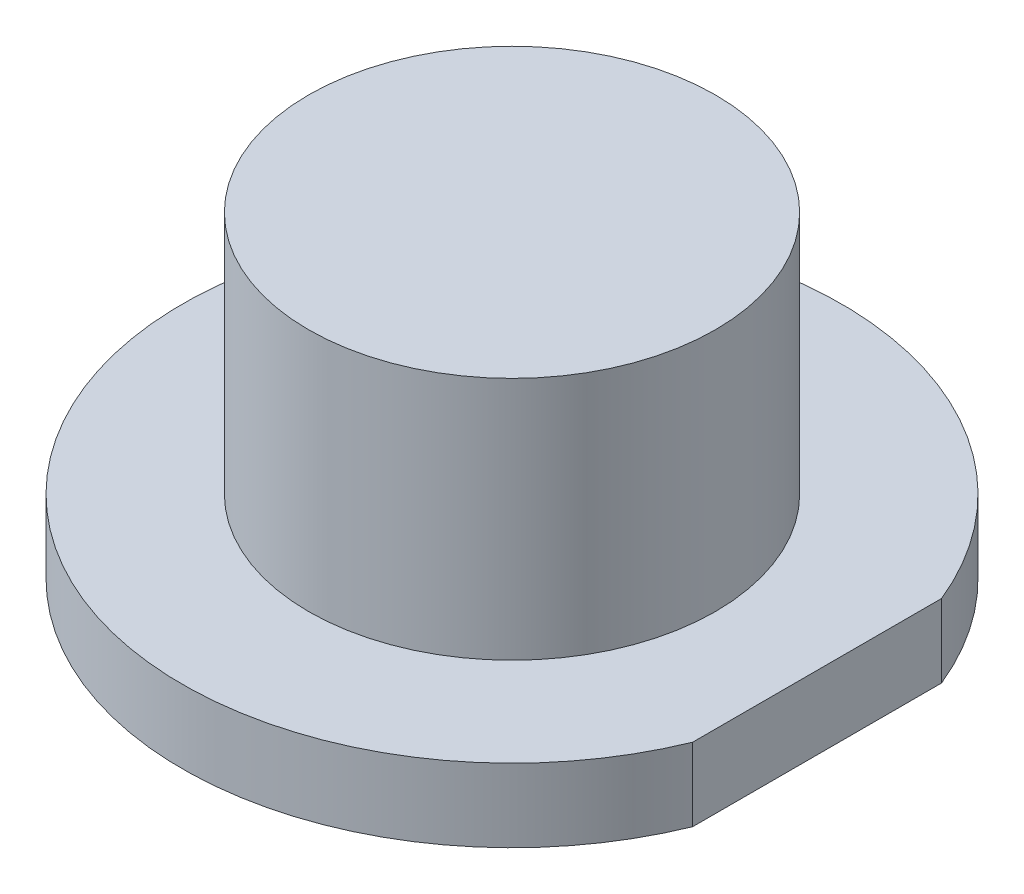
ISO-10303-21;
HEADER;
FILE_DESCRIPTION(('STEP AP214'),'2;1');
FILE_NAME('part.step','',(''),(''),'','','');
FILE_SCHEMA(('AUTOMOTIVE_DESIGN { 1 0 10303 214 1 1 1 1 }'));
ENDSEC;
DATA;
#1=APPLICATION_CONTEXT('core data for automotive mechanical design processes');
#2=APPLICATION_PROTOCOL_DEFINITION('international standard','automotive_design',2000,#1);
#3=PRODUCT_CONTEXT('',#1,'mechanical');
#4=PRODUCT('Part','Part','',(#3));
#5=PRODUCT_RELATED_PRODUCT_CATEGORY('part','',(#4));
#6=PRODUCT_DEFINITION_FORMATION('','',#4);
#7=PRODUCT_DEFINITION_CONTEXT('part definition',#1,'design');
#8=PRODUCT_DEFINITION('design','',#6,#7);
#9=PRODUCT_DEFINITION_SHAPE('','',#8);
#10=(LENGTH_UNIT() NAMED_UNIT(*) SI_UNIT(.MILLI.,.METRE.));
#11=(NAMED_UNIT(*) PLANE_ANGLE_UNIT() SI_UNIT($,.RADIAN.));
#12=(NAMED_UNIT(*) SI_UNIT($,.STERADIAN.) SOLID_ANGLE_UNIT());
#13=UNCERTAINTY_MEASURE_WITH_UNIT(LENGTH_MEASURE(1.E-05),#10,'distance_accuracy_value','');
#14=(GEOMETRIC_REPRESENTATION_CONTEXT(3) GLOBAL_UNCERTAINTY_ASSIGNED_CONTEXT((#13)) GLOBAL_UNIT_ASSIGNED_CONTEXT((#10,
#11,#12)) REPRESENTATION_CONTEXT('',''));
#15=CARTESIAN_POINT('',(0.,0.,0.));
#16=DIRECTION('',(0.,0.,1.));
#17=DIRECTION('',(1.,0.,0.));
#18=AXIS2_PLACEMENT_3D('',#15,#16,#17);
#19=CARTESIAN_POINT('',(0.,0.9,0.));
#20=DIRECTION('',(0.,-1.,0.));
#21=DIRECTION('',(0.,0.,-1.));
#22=AXIS2_PLACEMENT_3D('',#19,#20,#21);
#23=CYLINDRICAL_SURFACE('',#22,4.05);
#24=CARTESIAN_POINT('',(0.,0.9,0.));
#25=DIRECTION('',(0.,1.,0.));
#26=DIRECTION('',(0.,0.,1.));
#27=AXIS2_PLACEMENT_3D('',#24,#25,#26);
#28=CIRCLE('',#27,4.05);
#29=CARTESIAN_POINT('',(3.75,0.9,-1.52970585407783));
#30=VERTEX_POINT('',#29);
#31=CARTESIAN_POINT('',(3.75,0.9,1.52970585407783));
#32=VERTEX_POINT('',#31);
#33=EDGE_CURVE('E52',#30,#32,#28,.T.);
#34=ORIENTED_EDGE('',*,*,#33,.F.);
#35=DIRECTION('',(0.,1.,0.));
#36=VECTOR('',#35,1.);
#37=CARTESIAN_POINT('',(3.75,0.,-1.52970585407783));
#38=LINE('',#37,#36);
#39=CARTESIAN_POINT('',(3.75,0.,-1.52970585407783));
#40=VERTEX_POINT('',#39);
#41=EDGE_CURVE('E287',#40,#30,#38,.T.);
#42=ORIENTED_EDGE('',*,*,#41,.F.);
#43=CARTESIAN_POINT('',(0.,0.,0.));
#44=DIRECTION('',(0.,1.,0.));
#45=DIRECTION('',(0.,0.,1.));
#46=AXIS2_PLACEMENT_3D('',#43,#44,#45);
#47=CIRCLE('',#46,4.05);
#48=CARTESIAN_POINT('',(3.75,0.,1.52970585407783));
#49=VERTEX_POINT('',#48);
#50=EDGE_CURVE('E46',#40,#49,#47,.T.);
#51=ORIENTED_EDGE('',*,*,#50,.T.);
#52=DIRECTION('',(0.,1.,0.));
#53=VECTOR('',#52,1.);
#54=CARTESIAN_POINT('',(3.75,0.,1.52970585407783));
#55=LINE('',#54,#53);
#56=EDGE_CURVE('E290',#49,#32,#55,.T.);
#57=ORIENTED_EDGE('',*,*,#56,.T.);
#58=EDGE_LOOP('',(#34,#42,#51,#57));
#59=FACE_BOUND('',#58,.T.);
#60=ADVANCED_FACE('F43',(#59),#23,.T.);
#61=CARTESIAN_POINT('',(0.,0.9,0.));
#62=DIRECTION('',(0.,1.,0.));
#63=DIRECTION('',(0.,0.,1.));
#64=AXIS2_PLACEMENT_3D('',#61,#62,#63);
#65=PLANE('',#64);
#66=CARTESIAN_POINT('',(0.,0.9,0.));
#67=DIRECTION('',(0.,1.,0.));
#68=DIRECTION('',(0.,0.,1.));
#69=AXIS2_PLACEMENT_3D('',#66,#67,#68);
#70=CIRCLE('',#69,2.5);
#71=CARTESIAN_POINT('',(0.,0.9,2.5));
#72=VERTEX_POINT('',#71);
#73=EDGE_CURVE('E11',#72,#72,#70,.T.);
#74=ORIENTED_EDGE('',*,*,#73,.F.);
#75=EDGE_LOOP('',(#74));
#76=FACE_BOUND('',#75,.T.);
#77=DIRECTION('',(0.,0.,1.));
#78=VECTOR('',#77,1.);
#79=CARTESIAN_POINT('',(3.75,0.9,0.));
#80=LINE('',#79,#78);
#81=EDGE_CURVE('E281',#30,#32,#80,.T.);
#82=ORIENTED_EDGE('',*,*,#81,.F.);
#83=ORIENTED_EDGE('',*,*,#33,.T.);
#84=EDGE_LOOP('',(#82,#83));
#85=FACE_BOUND('',#84,.T.);
#86=ADVANCED_FACE('F309',(#76,#85),#65,.T.);
#87=CARTESIAN_POINT('',(0.,0.,0.));
#88=DIRECTION('',(0.,1.,0.));
#89=DIRECTION('',(0.,0.,1.));
#90=AXIS2_PLACEMENT_3D('',#87,#88,#89);
#91=PLANE('',#90);
#92=CARTESIAN_POINT('',(0.,0.,0.));
#93=DIRECTION('',(0.,-1.,0.));
#94=DIRECTION('',(0.,0.,-1.));
#95=AXIS2_PLACEMENT_3D('',#92,#93,#94);
#96=CIRCLE('',#95,2.);
#97=CARTESIAN_POINT('',(0.25,0.,-1.98431348329844));
#98=VERTEX_POINT('',#97);
#99=CARTESIAN_POINT('',(1.98431348329844,0.,-0.25));
#100=VERTEX_POINT('',#99);
#101=EDGE_CURVE('E170',#98,#100,#96,.T.);
#102=ORIENTED_EDGE('',*,*,#101,.F.);
#103=DIRECTION('',(0.,0.,-1.));
#104=VECTOR('',#103,1.);
#105=CARTESIAN_POINT('',(0.25,0.,0.));
#106=LINE('',#105,#104);
#107=CARTESIAN_POINT('',(0.25,0.,-0.25));
#108=VERTEX_POINT('',#107);
#109=EDGE_CURVE('E60',#108,#98,#106,.T.);
#110=ORIENTED_EDGE('',*,*,#109,.F.);
#111=DIRECTION('',(1.,0.,0.));
#112=VECTOR('',#111,1.);
#113=CARTESIAN_POINT('',(0.,0.,-0.25));
#114=LINE('',#113,#112);
#115=EDGE_CURVE('E166',#108,#100,#114,.T.);
#116=ORIENTED_EDGE('',*,*,#115,.T.);
#117=EDGE_LOOP('',(#102,#110,#116));
#118=FACE_BOUND('',#117,.T.);
#119=CARTESIAN_POINT('',(0.,0.,0.));
#120=DIRECTION('',(0.,-1.,0.));
#121=DIRECTION('',(0.,0.,-1.));
#122=AXIS2_PLACEMENT_3D('',#119,#120,#121);
#123=CIRCLE('',#122,2.);
#124=CARTESIAN_POINT('',(-1.98431348329844,0.,-0.25));
#125=VERTEX_POINT('',#124);
#126=CARTESIAN_POINT('',(-0.25,0.,-1.98431348329844));
#127=VERTEX_POINT('',#126);
#128=EDGE_CURVE('E233',#125,#127,#123,.T.);
#129=ORIENTED_EDGE('',*,*,#128,.F.);
#130=DIRECTION('',(-1.,0.,0.));
#131=VECTOR('',#130,1.);
#132=CARTESIAN_POINT('',(0.,0.,-0.25));
#133=LINE('',#132,#131);
#134=CARTESIAN_POINT('',(-0.25,0.,-0.25));
#135=VERTEX_POINT('',#134);
#136=EDGE_CURVE('E68',#135,#125,#133,.T.);
#137=ORIENTED_EDGE('',*,*,#136,.F.);
#138=DIRECTION('',(0.,0.,-1.));
#139=VECTOR('',#138,1.);
#140=CARTESIAN_POINT('',(-0.25,0.,0.));
#141=LINE('',#140,#139);
#142=EDGE_CURVE('E223',#135,#127,#141,.T.);
#143=ORIENTED_EDGE('',*,*,#142,.T.);
#144=EDGE_LOOP('',(#129,#137,#143));
#145=FACE_BOUND('',#144,.T.);
#146=CARTESIAN_POINT('',(0.,0.,0.));
#147=DIRECTION('',(0.,-1.,0.));
#148=DIRECTION('',(0.,0.,-1.));
#149=AXIS2_PLACEMENT_3D('',#146,#147,#148);
#150=CIRCLE('',#149,2.);
#151=CARTESIAN_POINT('',(1.98431348329844,0.,0.25));
#152=VERTEX_POINT('',#151);
#153=CARTESIAN_POINT('',(0.25,0.,1.98431348329844));
#154=VERTEX_POINT('',#153);
#155=EDGE_CURVE('E200',#152,#154,#150,.T.);
#156=ORIENTED_EDGE('',*,*,#155,.F.);
#157=DIRECTION('',(1.,0.,0.));
#158=VECTOR('',#157,1.);
#159=CARTESIAN_POINT('',(0.,0.,0.25));
#160=LINE('',#159,#158);
#161=CARTESIAN_POINT('',(0.25,0.,0.25));
#162=VERTEX_POINT('',#161);
#163=EDGE_CURVE('E197',#162,#152,#160,.T.);
#164=ORIENTED_EDGE('',*,*,#163,.F.);
#165=DIRECTION('',(0.,0.,1.));
#166=VECTOR('',#165,1.);
#167=CARTESIAN_POINT('',(0.25,0.,0.));
#168=LINE('',#167,#166);
#169=EDGE_CURVE('E189',#162,#154,#168,.T.);
#170=ORIENTED_EDGE('',*,*,#169,.T.);
#171=EDGE_LOOP('',(#156,#164,#170));
#172=FACE_BOUND('',#171,.T.);
#173=CARTESIAN_POINT('',(0.,0.,0.));
#174=DIRECTION('',(0.,-1.,0.));
#175=DIRECTION('',(0.,0.,-1.));
#176=AXIS2_PLACEMENT_3D('',#173,#174,#175);
#177=CIRCLE('',#176,2.);
#178=CARTESIAN_POINT('',(-0.25,0.,1.98431348329844));
#179=VERTEX_POINT('',#178);
#180=CARTESIAN_POINT('',(-1.98431348329844,0.,0.25));
#181=VERTEX_POINT('',#180);
#182=EDGE_CURVE('E262',#179,#181,#177,.T.);
#183=ORIENTED_EDGE('',*,*,#182,.F.);
#184=DIRECTION('',(0.,0.,1.));
#185=VECTOR('',#184,1.);
#186=CARTESIAN_POINT('',(-0.25,0.,0.));
#187=LINE('',#186,#185);
#188=CARTESIAN_POINT('',(-0.25,0.,0.25));
#189=VERTEX_POINT('',#188);
#190=EDGE_CURVE('E211',#189,#179,#187,.T.);
#191=ORIENTED_EDGE('',*,*,#190,.F.);
#192=DIRECTION('',(-1.,0.,0.));
#193=VECTOR('',#192,1.);
#194=CARTESIAN_POINT('',(0.,0.,0.25));
#195=LINE('',#194,#193);
#196=EDGE_CURVE('E252',#189,#181,#195,.T.);
#197=ORIENTED_EDGE('',*,*,#196,.T.);
#198=EDGE_LOOP('',(#183,#191,#197));
#199=FACE_BOUND('',#198,.T.);
#200=ORIENTED_EDGE('',*,*,#50,.F.);
#201=DIRECTION('',(0.,0.,1.));
#202=VECTOR('',#201,1.);
#203=CARTESIAN_POINT('',(3.75,0.,0.));
#204=LINE('',#203,#202);
#205=EDGE_CURVE('E283',#40,#49,#204,.T.);
#206=ORIENTED_EDGE('',*,*,#205,.T.);
#207=EDGE_LOOP('',(#200,#206));
#208=FACE_BOUND('',#207,.T.);
#209=ADVANCED_FACE('F306',(#118,#145,#172,#199,#208),#91,.F.);
#210=CARTESIAN_POINT('',(3.75,0.,0.));
#211=DIRECTION('',(-1.,0.,0.));
#212=DIRECTION('',(0.,0.,1.));
#213=AXIS2_PLACEMENT_3D('',#210,#211,#212);
#214=PLANE('',#213);
#215=ORIENTED_EDGE('',*,*,#81,.T.);
#216=ORIENTED_EDGE('',*,*,#56,.F.);
#217=ORIENTED_EDGE('',*,*,#205,.F.);
#218=ORIENTED_EDGE('',*,*,#41,.T.);
#219=EDGE_LOOP('',(#215,#216,#217,#218));
#220=FACE_BOUND('',#219,.T.);
#221=ADVANCED_FACE('F308',(#220),#214,.F.);
#222=CARTESIAN_POINT('',(0.,3.9,0.));
#223=DIRECTION('',(0.,-1.,0.));
#224=DIRECTION('',(0.,0.,-1.));
#225=AXIS2_PLACEMENT_3D('',#222,#223,#224);
#226=CYLINDRICAL_SURFACE('',#225,2.5);
#227=CARTESIAN_POINT('',(0.,3.9,0.));
#228=DIRECTION('',(0.,1.,0.));
#229=DIRECTION('',(0.,0.,1.));
#230=AXIS2_PLACEMENT_3D('',#227,#228,#229);
#231=CIRCLE('',#230,2.5);
#232=CARTESIAN_POINT('',(0.,3.9,2.5));
#233=VERTEX_POINT('',#232);
#234=EDGE_CURVE('E272',#233,#233,#231,.T.);
#235=ORIENTED_EDGE('',*,*,#234,.F.);
#236=EDGE_LOOP('',(#235));
#237=FACE_BOUND('',#236,.T.);
#238=ORIENTED_EDGE('',*,*,#73,.T.);
#239=EDGE_LOOP('',(#238));
#240=FACE_BOUND('',#239,.T.);
#241=ADVANCED_FACE('F322',(#237,#240),#226,.T.);
#242=CARTESIAN_POINT('',(0.,3.9,0.));
#243=DIRECTION('',(0.,1.,0.));
#244=DIRECTION('',(0.,0.,1.));
#245=AXIS2_PLACEMENT_3D('',#242,#243,#244);
#246=PLANE('',#245);
#247=ORIENTED_EDGE('',*,*,#234,.T.);
#248=EDGE_LOOP('',(#247));
#249=FACE_BOUND('',#248,.T.);
#250=ADVANCED_FACE('F325',(#249),#246,.T.);
#251=CARTESIAN_POINT('',(-0.25,2.5,0.));
#252=DIRECTION('',(1.,0.,0.));
#253=DIRECTION('',(0.,0.,-1.));
#254=AXIS2_PLACEMENT_3D('',#251,#252,#253);
#255=PLANE('',#254);
#256=ORIENTED_EDGE('',*,*,#190,.T.);
#257=DIRECTION('',(0.,-1.,0.));
#258=VECTOR('',#257,1.);
#259=CARTESIAN_POINT('',(-0.25,2.5,1.98431348329844));
#260=LINE('',#259,#258);
#261=CARTESIAN_POINT('',(-0.25,2.5,1.98431348329844));
#262=VERTEX_POINT('',#261);
#263=EDGE_CURVE('E259',#262,#179,#260,.T.);
#264=ORIENTED_EDGE('',*,*,#263,.F.);
#265=DIRECTION('',(0.,0.,1.));
#266=VECTOR('',#265,1.);
#267=CARTESIAN_POINT('',(-0.25,2.5,0.));
#268=LINE('',#267,#266);
#269=CARTESIAN_POINT('',(-0.25,2.5,0.25));
#270=VERTEX_POINT('',#269);
#271=EDGE_CURVE('E247',#270,#262,#268,.T.);
#272=ORIENTED_EDGE('',*,*,#271,.F.);
#273=DIRECTION('',(0.,-1.,0.));
#274=VECTOR('',#273,1.);
#275=CARTESIAN_POINT('',(-0.25,2.5,0.25));
#276=LINE('',#275,#274);
#277=EDGE_CURVE('E269',#270,#189,#276,.T.);
#278=ORIENTED_EDGE('',*,*,#277,.T.);
#279=EDGE_LOOP('',(#256,#264,#272,#278));
#280=FACE_BOUND('',#279,.T.);
#281=ADVANCED_FACE('F329',(#280),#255,.F.);
#282=CARTESIAN_POINT('',(0.,2.5,0.25));
#283=DIRECTION('',(0.,0.,1.));
#284=DIRECTION('',(1.,0.,0.));
#285=AXIS2_PLACEMENT_3D('',#282,#283,#284);
#286=PLANE('',#285);
#287=ORIENTED_EDGE('',*,*,#196,.F.);
#288=ORIENTED_EDGE('',*,*,#277,.F.);
#289=DIRECTION('',(-1.,0.,0.));
#290=VECTOR('',#289,1.);
#291=CARTESIAN_POINT('',(0.,2.5,0.25));
#292=LINE('',#291,#290);
#293=CARTESIAN_POINT('',(-1.98431348329844,2.5,0.25));
#294=VERTEX_POINT('',#293);
#295=EDGE_CURVE('E256',#270,#294,#292,.T.);
#296=ORIENTED_EDGE('',*,*,#295,.T.);
#297=DIRECTION('',(0.,-1.,0.));
#298=VECTOR('',#297,1.);
#299=CARTESIAN_POINT('',(-1.98431348329844,2.5,0.25));
#300=LINE('',#299,#298);
#301=EDGE_CURVE('E273',#294,#181,#300,.T.);
#302=ORIENTED_EDGE('',*,*,#301,.T.);
#303=EDGE_LOOP('',(#287,#288,#296,#302));
#304=FACE_BOUND('',#303,.T.);
#305=ADVANCED_FACE('F333',(#304),#286,.T.);
#306=CARTESIAN_POINT('',(0.,2.5,0.));
#307=DIRECTION('',(0.,-1.,0.));
#308=DIRECTION('',(0.,0.,-1.));
#309=AXIS2_PLACEMENT_3D('',#306,#307,#308);
#310=CYLINDRICAL_SURFACE('',#309,2.);
#311=ORIENTED_EDGE('',*,*,#182,.T.);
#312=ORIENTED_EDGE('',*,*,#301,.F.);
#313=CARTESIAN_POINT('',(0.,2.5,0.));
#314=DIRECTION('',(0.,-1.,0.));
#315=DIRECTION('',(0.,0.,-1.));
#316=AXIS2_PLACEMENT_3D('',#313,#314,#315);
#317=CIRCLE('',#316,2.);
#318=EDGE_CURVE('E251',#262,#294,#317,.T.);
#319=ORIENTED_EDGE('',*,*,#318,.F.);
#320=ORIENTED_EDGE('',*,*,#263,.T.);
#321=EDGE_LOOP('',(#311,#312,#319,#320));
#322=FACE_BOUND('',#321,.T.);
#323=ADVANCED_FACE('F335',(#322),#310,.F.);
#324=CARTESIAN_POINT('',(0.,2.5,0.));
#325=DIRECTION('',(0.,-1.,0.));
#326=DIRECTION('',(0.,0.,-1.));
#327=AXIS2_PLACEMENT_3D('',#324,#325,#326);
#328=PLANE('',#327);
#329=ORIENTED_EDGE('',*,*,#271,.T.);
#330=ORIENTED_EDGE('',*,*,#318,.T.);
#331=ORIENTED_EDGE('',*,*,#295,.F.);
#332=EDGE_LOOP('',(#329,#330,#331));
#333=FACE_BOUND('',#332,.T.);
#334=ADVANCED_FACE('F338',(#333),#328,.T.);
#335=CARTESIAN_POINT('',(0.,2.5,0.25));
#336=DIRECTION('',(0.,0.,-1.));
#337=DIRECTION('',(-1.,0.,0.));
#338=AXIS2_PLACEMENT_3D('',#335,#336,#337);
#339=PLANE('',#338);
#340=ORIENTED_EDGE('',*,*,#163,.T.);
#341=DIRECTION('',(0.,-1.,0.));
#342=VECTOR('',#341,1.);
#343=CARTESIAN_POINT('',(1.98431348329844,2.5,0.25));
#344=LINE('',#343,#342);
#345=CARTESIAN_POINT('',(1.98431348329844,2.5,0.25));
#346=VERTEX_POINT('',#345);
#347=EDGE_CURVE('E196',#346,#152,#344,.T.);
#348=ORIENTED_EDGE('',*,*,#347,.F.);
#349=DIRECTION('',(1.,0.,0.));
#350=VECTOR('',#349,1.);
#351=CARTESIAN_POINT('',(0.,2.5,0.25));
#352=LINE('',#351,#350);
#353=CARTESIAN_POINT('',(0.25,2.5,0.25));
#354=VERTEX_POINT('',#353);
#355=EDGE_CURVE('E184',#354,#346,#352,.T.);
#356=ORIENTED_EDGE('',*,*,#355,.F.);
#357=DIRECTION('',(0.,-1.,0.));
#358=VECTOR('',#357,1.);
#359=CARTESIAN_POINT('',(0.25,2.5,0.25));
#360=LINE('',#359,#358);
#361=EDGE_CURVE('E208',#354,#162,#360,.T.);
#362=ORIENTED_EDGE('',*,*,#361,.T.);
#363=EDGE_LOOP('',(#340,#348,#356,#362));
#364=FACE_BOUND('',#363,.T.);
#365=ADVANCED_FACE('F345',(#364),#339,.F.);
#366=CARTESIAN_POINT('',(0.25,2.5,0.));
#367=DIRECTION('',(1.,0.,0.));
#368=DIRECTION('',(0.,0.,-1.));
#369=AXIS2_PLACEMENT_3D('',#366,#367,#368);
#370=PLANE('',#369);
#371=ORIENTED_EDGE('',*,*,#169,.F.);
#372=ORIENTED_EDGE('',*,*,#361,.F.);
#373=DIRECTION('',(0.,0.,1.));
#374=VECTOR('',#373,1.);
#375=CARTESIAN_POINT('',(0.25,2.5,0.));
#376=LINE('',#375,#374);
#377=CARTESIAN_POINT('',(0.25,2.5,1.98431348329844));
#378=VERTEX_POINT('',#377);
#379=EDGE_CURVE('E193',#354,#378,#376,.T.);
#380=ORIENTED_EDGE('',*,*,#379,.T.);
#381=DIRECTION('',(0.,-1.,0.));
#382=VECTOR('',#381,1.);
#383=CARTESIAN_POINT('',(0.25,2.5,1.98431348329844));
#384=LINE('',#383,#382);
#385=EDGE_CURVE('E212',#378,#154,#384,.T.);
#386=ORIENTED_EDGE('',*,*,#385,.T.);
#387=EDGE_LOOP('',(#371,#372,#380,#386));
#388=FACE_BOUND('',#387,.T.);
#389=ADVANCED_FACE('F365',(#388),#370,.T.);
#390=CARTESIAN_POINT('',(0.,2.5,0.));
#391=DIRECTION('',(0.,-1.,0.));
#392=DIRECTION('',(0.,0.,-1.));
#393=AXIS2_PLACEMENT_3D('',#390,#391,#392);
#394=CYLINDRICAL_SURFACE('',#393,2.);
#395=ORIENTED_EDGE('',*,*,#155,.T.);
#396=ORIENTED_EDGE('',*,*,#385,.F.);
#397=CARTESIAN_POINT('',(0.,2.5,0.));
#398=DIRECTION('',(0.,-1.,0.));
#399=DIRECTION('',(0.,0.,-1.));
#400=AXIS2_PLACEMENT_3D('',#397,#398,#399);
#401=CIRCLE('',#400,2.);
#402=EDGE_CURVE('E188',#346,#378,#401,.T.);
#403=ORIENTED_EDGE('',*,*,#402,.F.);
#404=ORIENTED_EDGE('',*,*,#347,.T.);
#405=EDGE_LOOP('',(#395,#396,#403,#404));
#406=FACE_BOUND('',#405,.T.);
#407=ADVANCED_FACE('F367',(#406),#394,.F.);
#408=CARTESIAN_POINT('',(0.,2.5,0.));
#409=DIRECTION('',(0.,-1.,0.));
#410=DIRECTION('',(0.,0.,-1.));
#411=AXIS2_PLACEMENT_3D('',#408,#409,#410);
#412=PLANE('',#411);
#413=ORIENTED_EDGE('',*,*,#355,.T.);
#414=ORIENTED_EDGE('',*,*,#402,.T.);
#415=ORIENTED_EDGE('',*,*,#379,.F.);
#416=EDGE_LOOP('',(#413,#414,#415));
#417=FACE_BOUND('',#416,.T.);
#418=ADVANCED_FACE('F351',(#417),#412,.T.);
#419=CARTESIAN_POINT('',(0.,2.5,-0.25));
#420=DIRECTION('',(0.,0.,1.));
#421=DIRECTION('',(1.,0.,0.));
#422=AXIS2_PLACEMENT_3D('',#419,#420,#421);
#423=PLANE('',#422);
#424=ORIENTED_EDGE('',*,*,#136,.T.);
#425=DIRECTION('',(0.,-1.,0.));
#426=VECTOR('',#425,1.);
#427=CARTESIAN_POINT('',(-1.98431348329844,2.5,-0.25));
#428=LINE('',#427,#426);
#429=CARTESIAN_POINT('',(-1.98431348329844,2.5,-0.25));
#430=VERTEX_POINT('',#429);
#431=EDGE_CURVE('E230',#430,#125,#428,.T.);
#432=ORIENTED_EDGE('',*,*,#431,.F.);
#433=DIRECTION('',(-1.,0.,0.));
#434=VECTOR('',#433,1.);
#435=CARTESIAN_POINT('',(0.,2.5,-0.25));
#436=LINE('',#435,#434);
#437=CARTESIAN_POINT('',(-0.25,2.5,-0.25));
#438=VERTEX_POINT('',#437);
#439=EDGE_CURVE('E218',#438,#430,#436,.T.);
#440=ORIENTED_EDGE('',*,*,#439,.F.);
#441=DIRECTION('',(0.,-1.,0.));
#442=VECTOR('',#441,1.);
#443=CARTESIAN_POINT('',(-0.25,2.5,-0.25));
#444=LINE('',#443,#442);
#445=EDGE_CURVE('E201',#438,#135,#444,.T.);
#446=ORIENTED_EDGE('',*,*,#445,.T.);
#447=EDGE_LOOP('',(#424,#432,#440,#446));
#448=FACE_BOUND('',#447,.T.);
#449=ADVANCED_FACE('F347',(#448),#423,.F.);
#450=CARTESIAN_POINT('',(-0.25,2.5,0.));
#451=DIRECTION('',(-1.,0.,0.));
#452=DIRECTION('',(0.,0.,1.));
#453=AXIS2_PLACEMENT_3D('',#450,#451,#452);
#454=PLANE('',#453);
#455=ORIENTED_EDGE('',*,*,#142,.F.);
#456=ORIENTED_EDGE('',*,*,#445,.F.);
#457=DIRECTION('',(0.,0.,-1.));
#458=VECTOR('',#457,1.);
#459=CARTESIAN_POINT('',(-0.25,2.5,0.));
#460=LINE('',#459,#458);
#461=CARTESIAN_POINT('',(-0.25,2.5,-1.98431348329844));
#462=VERTEX_POINT('',#461);
#463=EDGE_CURVE('E227',#438,#462,#460,.T.);
#464=ORIENTED_EDGE('',*,*,#463,.T.);
#465=DIRECTION('',(0.,-1.,0.));
#466=VECTOR('',#465,1.);
#467=CARTESIAN_POINT('',(-0.25,2.5,-1.98431348329844));
#468=LINE('',#467,#466);
#469=EDGE_CURVE('E242',#462,#127,#468,.T.);
#470=ORIENTED_EDGE('',*,*,#469,.T.);
#471=EDGE_LOOP('',(#455,#456,#464,#470));
#472=FACE_BOUND('',#471,.T.);
#473=ADVANCED_FACE('F350',(#472),#454,.T.);
#474=CARTESIAN_POINT('',(0.,2.5,0.));
#475=DIRECTION('',(0.,-1.,0.));
#476=DIRECTION('',(0.,0.,-1.));
#477=AXIS2_PLACEMENT_3D('',#474,#475,#476);
#478=CYLINDRICAL_SURFACE('',#477,2.);
#479=ORIENTED_EDGE('',*,*,#128,.T.);
#480=ORIENTED_EDGE('',*,*,#469,.F.);
#481=CARTESIAN_POINT('',(0.,2.5,0.));
#482=DIRECTION('',(0.,-1.,0.));
#483=DIRECTION('',(0.,0.,-1.));
#484=AXIS2_PLACEMENT_3D('',#481,#482,#483);
#485=CIRCLE('',#484,2.);
#486=EDGE_CURVE('E222',#430,#462,#485,.T.);
#487=ORIENTED_EDGE('',*,*,#486,.F.);
#488=ORIENTED_EDGE('',*,*,#431,.T.);
#489=EDGE_LOOP('',(#479,#480,#487,#488));
#490=FACE_BOUND('',#489,.T.);
#491=ADVANCED_FACE('F352',(#490),#478,.F.);
#492=CARTESIAN_POINT('',(0.,2.5,0.));
#493=DIRECTION('',(0.,-1.,0.));
#494=DIRECTION('',(0.,0.,-1.));
#495=AXIS2_PLACEMENT_3D('',#492,#493,#494);
#496=PLANE('',#495);
#497=ORIENTED_EDGE('',*,*,#439,.T.);
#498=ORIENTED_EDGE('',*,*,#486,.T.);
#499=ORIENTED_EDGE('',*,*,#463,.F.);
#500=EDGE_LOOP('',(#497,#498,#499));
#501=FACE_BOUND('',#500,.T.);
#502=ADVANCED_FACE('F355',(#501),#496,.T.);
#503=CARTESIAN_POINT('',(0.25,0.25,0.));
#504=DIRECTION('',(-1.,0.,0.));
#505=DIRECTION('',(0.,0.,1.));
#506=AXIS2_PLACEMENT_3D('',#503,#504,#505);
#507=PLANE('',#506);
#508=ORIENTED_EDGE('',*,*,#109,.T.);
#509=DIRECTION('',(0.,-1.,0.));
#510=VECTOR('',#509,1.);
#511=CARTESIAN_POINT('',(0.25,0.25,-1.98431348329844));
#512=LINE('',#511,#510);
#513=CARTESIAN_POINT('',(0.25,0.25,-1.98431348329844));
#514=VERTEX_POINT('',#513);
#515=EDGE_CURVE('E144',#514,#98,#512,.T.);
#516=ORIENTED_EDGE('',*,*,#515,.F.);
#517=DIRECTION('',(0.,0.,-1.));
#518=VECTOR('',#517,1.);
#519=CARTESIAN_POINT('',(0.25,0.25,0.));
#520=LINE('',#519,#518);
#521=CARTESIAN_POINT('',(0.25,0.25,-0.25));
#522=VERTEX_POINT('',#521);
#523=EDGE_CURVE('E148',#522,#514,#520,.T.);
#524=ORIENTED_EDGE('',*,*,#523,.F.);
#525=DIRECTION('',(0.,-1.,0.));
#526=VECTOR('',#525,1.);
#527=CARTESIAN_POINT('',(0.25,0.25,-0.25));
#528=LINE('',#527,#526);
#529=EDGE_CURVE('E179',#522,#108,#528,.T.);
#530=ORIENTED_EDGE('',*,*,#529,.T.);
#531=EDGE_LOOP('',(#508,#516,#524,#530));
#532=FACE_BOUND('',#531,.T.);
#533=ADVANCED_FACE('F146',(#532),#507,.F.);
#534=CARTESIAN_POINT('',(0.,0.25,-0.25));
#535=DIRECTION('',(0.,0.,-1.));
#536=DIRECTION('',(-1.,0.,0.));
#537=AXIS2_PLACEMENT_3D('',#534,#535,#536);
#538=PLANE('',#537);
#539=ORIENTED_EDGE('',*,*,#115,.F.);
#540=ORIENTED_EDGE('',*,*,#529,.F.);
#541=DIRECTION('',(1.,0.,0.));
#542=VECTOR('',#541,1.);
#543=CARTESIAN_POINT('',(0.,0.25,-0.25));
#544=LINE('',#543,#542);
#545=CARTESIAN_POINT('',(1.98431348329844,0.25,-0.25));
#546=VERTEX_POINT('',#545);
#547=EDGE_CURVE('E154',#522,#546,#544,.T.);
#548=ORIENTED_EDGE('',*,*,#547,.T.);
#549=DIRECTION('',(0.,-1.,0.));
#550=VECTOR('',#549,1.);
#551=CARTESIAN_POINT('',(1.98431348329844,0.25,-0.25));
#552=LINE('',#551,#550);
#553=EDGE_CURVE('E153',#546,#100,#552,.T.);
#554=ORIENTED_EDGE('',*,*,#553,.T.);
#555=EDGE_LOOP('',(#539,#540,#548,#554));
#556=FACE_BOUND('',#555,.T.);
#557=ADVANCED_FACE('F379',(#556),#538,.T.);
#558=CARTESIAN_POINT('',(0.,0.25,0.));
#559=DIRECTION('',(0.,-1.,0.));
#560=DIRECTION('',(0.,0.,-1.));
#561=AXIS2_PLACEMENT_3D('',#558,#559,#560);
#562=CYLINDRICAL_SURFACE('',#561,2.);
#563=ORIENTED_EDGE('',*,*,#101,.T.);
#564=ORIENTED_EDGE('',*,*,#553,.F.);
#565=CARTESIAN_POINT('',(0.,0.25,0.));
#566=DIRECTION('',(0.,-1.,0.));
#567=DIRECTION('',(0.,0.,-1.));
#568=AXIS2_PLACEMENT_3D('',#565,#566,#567);
#569=CIRCLE('',#568,2.);
#570=EDGE_CURVE('E158',#514,#546,#569,.T.);
#571=ORIENTED_EDGE('',*,*,#570,.F.);
#572=ORIENTED_EDGE('',*,*,#515,.T.);
#573=EDGE_LOOP('',(#563,#564,#571,#572));
#574=FACE_BOUND('',#573,.T.);
#575=ADVANCED_FACE('F159',(#574),#562,.F.);
#576=CARTESIAN_POINT('',(0.,0.25,0.));
#577=DIRECTION('',(0.,-1.,0.));
#578=DIRECTION('',(0.,0.,-1.));
#579=AXIS2_PLACEMENT_3D('',#576,#577,#578);
#580=PLANE('',#579);
#581=ORIENTED_EDGE('',*,*,#523,.T.);
#582=ORIENTED_EDGE('',*,*,#570,.T.);
#583=ORIENTED_EDGE('',*,*,#547,.F.);
#584=EDGE_LOOP('',(#581,#582,#583));
#585=FACE_BOUND('',#584,.T.);
#586=ADVANCED_FACE('F164',(#585),#580,.T.);
#587=CLOSED_SHELL('',(#60,#86,#209,#221,#241,#250,#281,#305,#323,#334,#365,#389,#407,#418,#449,
#473,#491,#502,#533,#557,#575,#586));
#588=MANIFOLD_SOLID_BREP('B2',#587);
#589=ADVANCED_BREP_SHAPE_REPRESENTATION('',(#18,#588),#14);
#590=SHAPE_DEFINITION_REPRESENTATION(#9,#589);
ENDSEC;
END-ISO-10303-21;
